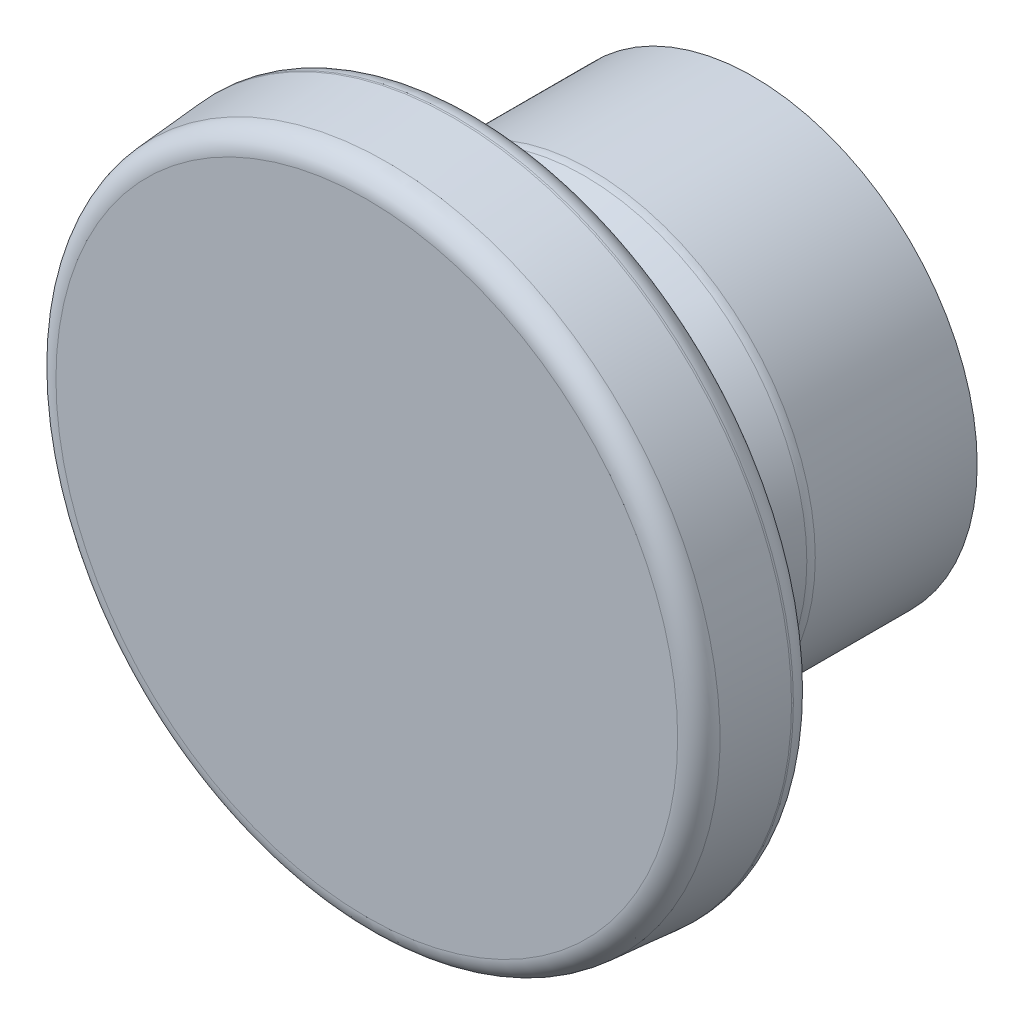
ISO-10303-21;
HEADER;
FILE_DESCRIPTION(('STEP AP214'),'2;1');
FILE_NAME('part.step','',(''),(''),'','','');
FILE_SCHEMA(('AUTOMOTIVE_DESIGN { 1 0 10303 214 1 1 1 1 }'));
ENDSEC;
DATA;
#1=APPLICATION_CONTEXT('core data for automotive mechanical design processes');
#2=APPLICATION_PROTOCOL_DEFINITION('international standard','automotive_design',2000,#1);
#3=PRODUCT_CONTEXT('',#1,'mechanical');
#4=PRODUCT('Part','Part','',(#3));
#5=PRODUCT_RELATED_PRODUCT_CATEGORY('part','',(#4));
#6=PRODUCT_DEFINITION_FORMATION('','',#4);
#7=PRODUCT_DEFINITION_CONTEXT('part definition',#1,'design');
#8=PRODUCT_DEFINITION('design','',#6,#7);
#9=PRODUCT_DEFINITION_SHAPE('','',#8);
#10=(LENGTH_UNIT() NAMED_UNIT(*) SI_UNIT(.MILLI.,.METRE.));
#11=(NAMED_UNIT(*) PLANE_ANGLE_UNIT() SI_UNIT($,.RADIAN.));
#12=(NAMED_UNIT(*) SI_UNIT($,.STERADIAN.) SOLID_ANGLE_UNIT());
#13=UNCERTAINTY_MEASURE_WITH_UNIT(LENGTH_MEASURE(1.E-05),#10,'distance_accuracy_value','');
#14=(GEOMETRIC_REPRESENTATION_CONTEXT(3) GLOBAL_UNCERTAINTY_ASSIGNED_CONTEXT((#13)) GLOBAL_UNIT_ASSIGNED_CONTEXT((#10,
#11,#12)) REPRESENTATION_CONTEXT('',''));
#15=CARTESIAN_POINT('',(0.,0.,0.));
#16=DIRECTION('',(0.,0.,1.));
#17=DIRECTION('',(1.,0.,0.));
#18=AXIS2_PLACEMENT_3D('',#15,#16,#17);
#19=CARTESIAN_POINT('',(-6.4389,0.,0.));
#20=DIRECTION('',(0.,0.,1.));
#21=DIRECTION('',(1.,0.,0.));
#22=AXIS2_PLACEMENT_3D('',#19,#20,#21);
#23=PLANE('',#22);
#24=CARTESIAN_POINT('',(0.,0.,0.));
#25=DIRECTION('',(0.,0.,1.));
#26=DIRECTION('',(1.,0.,0.));
#27=AXIS2_PLACEMENT_3D('',#24,#25,#26);
#28=CIRCLE('',#27,12.8778);
#29=CARTESIAN_POINT('',(12.8778,0.,0.));
#30=VERTEX_POINT('',#29);
#31=EDGE_CURVE('E20',#30,#30,#28,.T.);
#32=ORIENTED_EDGE('',*,*,#31,.F.);
#33=EDGE_LOOP('',(#32));
#34=FACE_BOUND('',#33,.T.);
#35=ADVANCED_FACE('F17',(#34),#23,.F.);
#36=CARTESIAN_POINT('',(0.,0.,11.1125));
#37=DIRECTION('',(0.,0.,1.));
#38=DIRECTION('',(1.,0.,0.));
#39=AXIS2_PLACEMENT_3D('',#36,#37,#38);
#40=CYLINDRICAL_SURFACE('',#39,12.8778);
#41=CARTESIAN_POINT('',(0.,0.,9.31062488196953));
#42=DIRECTION('',(0.,0.,1.));
#43=DIRECTION('',(1.,0.,0.));
#44=AXIS2_PLACEMENT_3D('',#41,#42,#43);
#45=CIRCLE('',#44,12.8778);
#46=CARTESIAN_POINT('',(12.8778,0.,9.31062488196953));
#47=VERTEX_POINT('',#46);
#48=EDGE_CURVE('E123',#47,#47,#45,.T.);
#49=ORIENTED_EDGE('',*,*,#48,.F.);
#50=EDGE_LOOP('',(#49));
#51=FACE_BOUND('',#50,.T.);
#52=ORIENTED_EDGE('',*,*,#31,.T.);
#53=EDGE_LOOP('',(#52));
#54=FACE_BOUND('',#53,.T.);
#55=ADVANCED_FACE('F134',(#51,#54),#40,.T.);
#56=CARTESIAN_POINT('',(0.,0.,9.31062488196953));
#57=DIRECTION('',(0.,0.,1.));
#58=DIRECTION('',(1.,0.,0.));
#59=AXIS2_PLACEMENT_3D('',#56,#57,#58);
#60=TOROIDAL_SURFACE('',#59,11.6077999999999,1.27000000000005);
#61=ORIENTED_EDGE('',*,*,#48,.T.);
#62=EDGE_LOOP('',(#61));
#63=FACE_BOUND('',#62,.T.);
#64=CARTESIAN_POINT('',(0.,0.,9.72749709240071));
#65=DIRECTION('',(0.,0.,-1.));
#66=DIRECTION('',(-1.,0.,0.));
#67=AXIS2_PLACEMENT_3D('',#64,#65,#66);
#68=CIRCLE('',#67,12.8074322602336);
#69=CARTESIAN_POINT('',(-12.8074322602336,0.,9.72749709240071));
#70=VERTEX_POINT('',#69);
#71=EDGE_CURVE('E118',#70,#70,#68,.F.);
#72=ORIENTED_EDGE('',*,*,#71,.F.);
#73=EDGE_LOOP('',(#72));
#74=FACE_BOUND('',#73,.T.);
#75=ADVANCED_FACE('F130',(#63,#74),#60,.T.);
#76=CARTESIAN_POINT('',(0.,0.,9.72749709240071));
#77=DIRECTION('',(0.,0.,-1.));
#78=DIRECTION('',(-1.,0.,0.));
#79=AXIS2_PLACEMENT_3D('',#76,#77,#78);
#80=CONICAL_SURFACE('',#79,12.8074322602336,0.3344459141);
#81=ORIENTED_EDGE('',*,*,#71,.T.);
#82=EDGE_LOOP('',(#81));
#83=FACE_BOUND('',#82,.T.);
#84=CARTESIAN_POINT('',(0.,0.,14.605));
#85=DIRECTION('',(0.,0.,1.));
#86=DIRECTION('',(1.,0.,0.));
#87=AXIS2_PLACEMENT_3D('',#84,#85,#86);
#88=CIRCLE('',#87,11.1125);
#89=CARTESIAN_POINT('',(11.1125,0.,14.605));
#90=VERTEX_POINT('',#89);
#91=EDGE_CURVE('E109',#90,#90,#88,.T.);
#92=ORIENTED_EDGE('',*,*,#91,.F.);
#93=EDGE_LOOP('',(#92));
#94=FACE_BOUND('',#93,.T.);
#95=ADVANCED_FACE('F133',(#83,#94),#80,.T.);
#96=CARTESIAN_POINT('',(0.,0.,11.1125));
#97=DIRECTION('',(0.,0.,1.));
#98=DIRECTION('',(1.,0.,0.));
#99=AXIS2_PLACEMENT_3D('',#96,#97,#98);
#100=CYLINDRICAL_SURFACE('',#99,11.1125);
#101=CARTESIAN_POINT('',(0.,0.,15.875));
#102=DIRECTION('',(0.,0.,1.));
#103=DIRECTION('',(1.,0.,0.));
#104=AXIS2_PLACEMENT_3D('',#101,#102,#103);
#105=CIRCLE('',#104,11.1125);
#106=CARTESIAN_POINT('',(11.1125,0.,15.875));
#107=VERTEX_POINT('',#106);
#108=EDGE_CURVE('E117',#107,#107,#105,.F.);
#109=ORIENTED_EDGE('',*,*,#108,.T.);
#110=EDGE_LOOP('',(#109));
#111=FACE_BOUND('',#110,.T.);
#112=ORIENTED_EDGE('',*,*,#91,.T.);
#113=EDGE_LOOP('',(#112));
#114=FACE_BOUND('',#113,.T.);
#115=ADVANCED_FACE('F207',(#111,#114),#100,.T.);
#116=CARTESIAN_POINT('',(-15.33525,0.,15.875));
#117=DIRECTION('',(0.,0.,1.));
#118=DIRECTION('',(1.,0.,0.));
#119=AXIS2_PLACEMENT_3D('',#116,#117,#118);
#120=PLANE('',#119);
#121=ORIENTED_EDGE('',*,*,#108,.F.);
#122=EDGE_LOOP('',(#121));
#123=FACE_BOUND('',#122,.T.);
#124=CARTESIAN_POINT('',(0.,0.,15.875));
#125=DIRECTION('',(0.,0.,1.));
#126=DIRECTION('',(1.,0.,0.));
#127=AXIS2_PLACEMENT_3D('',#124,#125,#126);
#128=CIRCLE('',#127,18.1823424816752);
#129=CARTESIAN_POINT('',(18.1823424816752,0.,15.875));
#130=VERTEX_POINT('',#129);
#131=EDGE_CURVE('E51',#130,#130,#128,.T.);
#132=ORIENTED_EDGE('',*,*,#131,.F.);
#133=EDGE_LOOP('',(#132));
#134=FACE_BOUND('',#133,.T.);
#135=ADVANCED_FACE('F86',(#123,#134),#120,.F.);
#136=CARTESIAN_POINT('',(0.,0.,17.145));
#137=DIRECTION('',(0.,0.,1.));
#138=DIRECTION('',(1.,0.,0.));
#139=AXIS2_PLACEMENT_3D('',#136,#137,#138);
#140=TOROIDAL_SURFACE('',#139,18.1823425,1.27);
#141=ORIENTED_EDGE('',*,*,#131,.T.);
#142=EDGE_LOOP('',(#141));
#143=FACE_BOUND('',#142,.T.);
#144=CARTESIAN_POINT('',(4.77349156730034E-09,5.12530962115675E-08,17.1449992607066));
#145=DIRECTION('',(6.44157674744989E-09,5.91643609542317E-08,0.999999999999998));
#146=DIRECTION('',(1.,0.,-6.44157672841927E-09));
#147=AXIS2_PLACEMENT_3D('',#144,#145,#146);
#148=CIRCLE('',#147,19.4523425298843);
#149=CARTESIAN_POINT('',(-19.4523425314754,-2.00125771679243E-09,17.1449992189387));
#150=VERTEX_POINT('',#149);
#151=CARTESIAN_POINT('',(19.4523425298843,0.,17.1449992607066));
#152=VERTEX_POINT('',#151);
#153=EDGE_CURVE('E42',#150,#152,#148,.T.);
#154=ORIENTED_EDGE('',*,*,#153,.F.);
#155=CARTESIAN_POINT('',(-4.77349163668926E-09,-5.12530962115674E-08,17.1449992607066));
#156=DIRECTION('',(-6.44157827985277E-09,-5.91643605506292E-08,0.999999999999998));
#157=DIRECTION('',(1.,0.,6.44157833362556E-09));
#158=AXIS2_PLACEMENT_3D('',#155,#156,#157);
#159=CIRCLE('',#158,19.4523425298843);
#160=EDGE_CURVE('E55',#152,#150,#159,.T.);
#161=ORIENTED_EDGE('',*,*,#160,.F.);
#162=EDGE_LOOP('',(#154,#161));
#163=FACE_BOUND('',#162,.T.);
#164=ADVANCED_FACE('F58',(#143,#163),#140,.T.);
#165=CARTESIAN_POINT('',(4.77349156730034E-09,5.12530962115676E-08,17.1449992607066));
#166=DIRECTION('',(6.44157674744989E-09,5.91643609542317E-08,0.999999999999998));
#167=DIRECTION('',(1.,0.,-6.4415767474499E-09));
#168=AXIS2_PLACEMENT_3D('',#165,#166,#167);
#169=TOROIDAL_SURFACE('',#168,18.1823371126187,1.27000541726556);
#170=ORIENTED_EDGE('',*,*,#153,.T.);
#171=CARTESIAN_POINT('',(18.182337107845,-5.12530962115675E-08,17.1449993778296));
#172=DIRECTION('',(0.,0.999999999999998,5.91643605506292E-08));
#173=DIRECTION('',(1.,0.,6.44157720927116E-09));
#174=AXIS2_PLACEMENT_3D('',#171,#172,#173);
#175=CIRCLE('',#174,1.2700054172658);
#176=CARTESIAN_POINT('',(19.4482978908355,-2.86225427825523E-08,17.2462764327328));
#177=VERTEX_POINT('',#176);
#178=EDGE_CURVE('E48',#177,#152,#175,.T.);
#179=ORIENTED_EDGE('',*,*,#178,.F.);
#180=CARTESIAN_POINT('',(0.,0.,17.2462764322944));
#181=DIRECTION('',(0.,0.,-1.));
#182=DIRECTION('',(-1.,0.,0.));
#183=AXIS2_PLACEMENT_3D('',#180,#181,#182);
#184=CIRCLE('',#183,19.4482978853551);
#185=CARTESIAN_POINT('',(-19.4482978859639,-2.00086848659721E-09,17.2462764323431));
#186=VERTEX_POINT('',#185);
#187=EDGE_CURVE('E32',#186,#177,#184,.F.);
#188=ORIENTED_EDGE('',*,*,#187,.F.);
#189=CARTESIAN_POINT('',(-18.182337117392,-3.34616032033257E-09,17.1449991435837));
#190=DIRECTION('',(-2.634805892389E-09,-0.999999999999998,-5.91643605676015E-08));
#191=DIRECTION('',(-1.,2.63480627350097E-09,-6.44157919454778E-09));
#192=AXIS2_PLACEMENT_3D('',#189,#190,#191);
#193=CIRCLE('',#192,1.2700054172658);
#194=EDGE_CURVE('E50',#150,#186,#193,.F.);
#195=ORIENTED_EDGE('',*,*,#194,.F.);
#196=EDGE_LOOP('',(#170,#179,#188,#195));
#197=FACE_BOUND('',#196,.T.);
#198=ADVANCED_FACE('F47',(#197),#169,.T.);
#199=CARTESIAN_POINT('',(-4.77349163668927E-09,-5.12530962115674E-08,17.1449992607066));
#200=DIRECTION('',(-6.44157827985277E-09,-5.91643605506292E-08,0.999999999999998));
#201=DIRECTION('',(1.,0.,6.44157827985278E-09));
#202=AXIS2_PLACEMENT_3D('',#199,#200,#201);
#203=TOROIDAL_SURFACE('',#202,18.1823371126185,1.2700054172658);
#204=ORIENTED_EDGE('',*,*,#178,.T.);
#205=ORIENTED_EDGE('',*,*,#160,.T.);
#206=ORIENTED_EDGE('',*,*,#194,.T.);
#207=CARTESIAN_POINT('',(0.,0.,17.2462764322944));
#208=DIRECTION('',(0.,0.,-1.));
#209=DIRECTION('',(-1.,0.,0.));
#210=AXIS2_PLACEMENT_3D('',#207,#208,#209);
#211=CIRCLE('',#210,19.4482978853551);
#212=EDGE_CURVE('E56',#177,#186,#211,.F.);
#213=ORIENTED_EDGE('',*,*,#212,.F.);
#214=EDGE_LOOP('',(#204,#205,#206,#213));
#215=FACE_BOUND('',#214,.T.);
#216=ADVANCED_FACE('F54',(#215),#203,.T.);
#217=CARTESIAN_POINT('',(0.,0.,17.2462764322944));
#218=DIRECTION('',(0.,0.,-1.));
#219=DIRECTION('',(0.,1.,0.));
#220=AXIS2_PLACEMENT_3D('',#217,#218,#219);
#221=CONICAL_SURFACE('',#220,19.4482978853551,0.0798299856999997);
#222=ORIENTED_EDGE('',*,*,#187,.T.);
#223=ORIENTED_EDGE('',*,*,#212,.T.);
#224=EDGE_LOOP('',(#222,#223));
#225=FACE_BOUND('',#224,.T.);
#226=CARTESIAN_POINT('',(0.,0.,21.056276433756));
#227=DIRECTION('',(0.,0.,-1.));
#228=DIRECTION('',(-1.,0.,0.));
#229=AXIS2_PLACEMENT_3D('',#226,#227,#228);
#230=CIRCLE('',#229,19.1434979036243);
#231=CARTESIAN_POINT('',(-19.1434979036243,0.,21.056276433756));
#232=VERTEX_POINT('',#231);
#233=EDGE_CURVE('E26',#232,#232,#230,.F.);
#234=ORIENTED_EDGE('',*,*,#233,.F.);
#235=EDGE_LOOP('',(#234));
#236=FACE_BOUND('',#235,.T.);
#237=ADVANCED_FACE('F153',(#225,#236),#221,.T.);
#238=CARTESIAN_POINT('',(0.,0.,20.955));
#239=DIRECTION('',(0.,0.,-1.));
#240=DIRECTION('',(-1.,0.,0.));
#241=AXIS2_PLACEMENT_3D('',#238,#239,#240);
#242=TOROIDAL_SURFACE('',#241,17.8775425,1.27000000000002);
#243=CARTESIAN_POINT('',(0.,0.,22.225));
#244=DIRECTION('',(0.,0.,-1.));
#245=DIRECTION('',(-1.,0.,0.));
#246=AXIS2_PLACEMENT_3D('',#243,#244,#245);
#247=CIRCLE('',#246,17.8775424816752);
#248=CARTESIAN_POINT('',(-17.8775424816752,0.,22.225));
#249=VERTEX_POINT('',#248);
#250=EDGE_CURVE('E11',#249,#249,#247,.T.);
#251=ORIENTED_EDGE('',*,*,#250,.T.);
#252=EDGE_LOOP('',(#251));
#253=FACE_BOUND('',#252,.T.);
#254=ORIENTED_EDGE('',*,*,#233,.T.);
#255=EDGE_LOOP('',(#254));
#256=FACE_BOUND('',#255,.T.);
#257=ADVANCED_FACE('F147',(#253,#256),#242,.T.);
#258=CARTESIAN_POINT('',(-9.525,0.,22.225));
#259=DIRECTION('',(0.,0.,-1.));
#260=DIRECTION('',(-1.,0.,0.));
#261=AXIS2_PLACEMENT_3D('',#258,#259,#260);
#262=PLANE('',#261);
#263=ORIENTED_EDGE('',*,*,#250,.F.);
#264=EDGE_LOOP('',(#263));
#265=FACE_BOUND('',#264,.T.);
#266=ADVANCED_FACE('F145',(#265),#262,.F.);
#267=CLOSED_SHELL('',(#35,#55,#75,#95,#115,#135,#164,#198,#216,#237,#257,#266));
#268=MANIFOLD_SOLID_BREP('B1',#267);
#269=ADVANCED_BREP_SHAPE_REPRESENTATION('',(#18,#268),#14);
#270=SHAPE_DEFINITION_REPRESENTATION(#9,#269);
ENDSEC;
END-ISO-10303-21;
